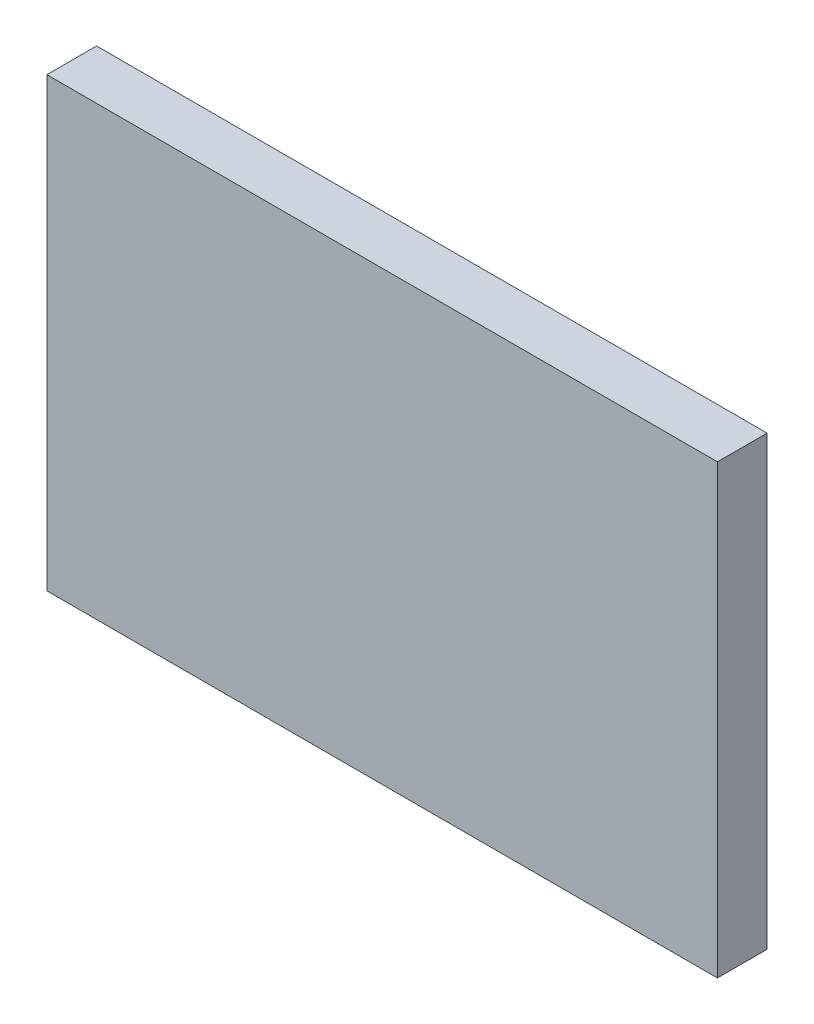
ISO-10303-21;
HEADER;
FILE_DESCRIPTION(('STEP AP214'),'2;1');
FILE_NAME('part.step','',(''),(''),'','','');
FILE_SCHEMA(('AUTOMOTIVE_DESIGN { 1 0 10303 214 1 1 1 1 }'));
ENDSEC;
DATA;
#1=APPLICATION_CONTEXT('core data for automotive mechanical design processes');
#2=APPLICATION_PROTOCOL_DEFINITION('international standard','automotive_design',2000,#1);
#3=PRODUCT_CONTEXT('',#1,'mechanical');
#4=PRODUCT('Part','Part','',(#3));
#5=PRODUCT_RELATED_PRODUCT_CATEGORY('part','',(#4));
#6=PRODUCT_DEFINITION_FORMATION('','',#4);
#7=PRODUCT_DEFINITION_CONTEXT('part definition',#1,'design');
#8=PRODUCT_DEFINITION('design','',#6,#7);
#9=PRODUCT_DEFINITION_SHAPE('','',#8);
#10=(LENGTH_UNIT() NAMED_UNIT(*) SI_UNIT(.MILLI.,.METRE.));
#11=(NAMED_UNIT(*) PLANE_ANGLE_UNIT() SI_UNIT($,.RADIAN.));
#12=(NAMED_UNIT(*) SI_UNIT($,.STERADIAN.) SOLID_ANGLE_UNIT());
#13=UNCERTAINTY_MEASURE_WITH_UNIT(LENGTH_MEASURE(1.E-05),#10,'distance_accuracy_value','');
#14=(GEOMETRIC_REPRESENTATION_CONTEXT(3) GLOBAL_UNCERTAINTY_ASSIGNED_CONTEXT((#13)) GLOBAL_UNIT_ASSIGNED_CONTEXT((#10,
#11,#12)) REPRESENTATION_CONTEXT('',''));
#15=CARTESIAN_POINT('',(0.,0.,0.));
#16=DIRECTION('',(0.,0.,1.));
#17=DIRECTION('',(1.,0.,0.));
#18=AXIS2_PLACEMENT_3D('',#15,#16,#17);
#19=CARTESIAN_POINT('',(0.,0.,12.7));
#20=DIRECTION('',(1.,0.,0.));
#21=DIRECTION('',(0.,0.,-1.));
#22=AXIS2_PLACEMENT_3D('',#19,#20,#21);
#23=PLANE('',#22);
#24=DIRECTION('',(0.,-1.,0.));
#25=VECTOR('',#24,1.);
#26=CARTESIAN_POINT('',(0.,0.,0.));
#27=LINE('',#26,#25);
#28=CARTESIAN_POINT('',(0.,114.3,0.));
#29=VERTEX_POINT('',#28);
#30=CARTESIAN_POINT('',(0.,0.,0.));
#31=VERTEX_POINT('',#30);
#32=EDGE_CURVE('E96',#29,#31,#27,.T.);
#33=ORIENTED_EDGE('',*,*,#32,.T.);
#34=DIRECTION('',(0.,0.,-1.));
#35=VECTOR('',#34,1.);
#36=CARTESIAN_POINT('',(0.,0.,12.7));
#37=LINE('',#36,#35);
#38=CARTESIAN_POINT('',(0.,0.,12.7));
#39=VERTEX_POINT('',#38);
#40=EDGE_CURVE('E11',#39,#31,#37,.T.);
#41=ORIENTED_EDGE('',*,*,#40,.F.);
#42=DIRECTION('',(0.,-1.,0.));
#43=VECTOR('',#42,1.);
#44=CARTESIAN_POINT('',(0.,0.,12.7));
#45=LINE('',#44,#43);
#46=CARTESIAN_POINT('',(0.,114.3,12.7));
#47=VERTEX_POINT('',#46);
#48=EDGE_CURVE('E84',#47,#39,#45,.T.);
#49=ORIENTED_EDGE('',*,*,#48,.F.);
#50=DIRECTION('',(0.,0.,-1.));
#51=VECTOR('',#50,1.);
#52=CARTESIAN_POINT('',(0.,114.3,12.7));
#53=LINE('',#52,#51);
#54=EDGE_CURVE('E92',#47,#29,#53,.T.);
#55=ORIENTED_EDGE('',*,*,#54,.T.);
#56=EDGE_LOOP('',(#33,#41,#49,#55));
#57=FACE_BOUND('',#56,.T.);
#58=ADVANCED_FACE('F33',(#57),#23,.F.);
#59=CARTESIAN_POINT('',(0.,0.,12.7));
#60=DIRECTION('',(0.,1.,0.));
#61=DIRECTION('',(0.,0.,1.));
#62=AXIS2_PLACEMENT_3D('',#59,#60,#61);
#63=PLANE('',#62);
#64=DIRECTION('',(1.,0.,0.));
#65=VECTOR('',#64,1.);
#66=CARTESIAN_POINT('',(0.,0.,0.));
#67=LINE('',#66,#65);
#68=CARTESIAN_POINT('',(171.45,0.,0.));
#69=VERTEX_POINT('',#68);
#70=EDGE_CURVE('E88',#31,#69,#67,.T.);
#71=ORIENTED_EDGE('',*,*,#70,.T.);
#72=DIRECTION('',(0.,0.,-1.));
#73=VECTOR('',#72,1.);
#74=CARTESIAN_POINT('',(171.45,0.,12.7));
#75=LINE('',#74,#73);
#76=CARTESIAN_POINT('',(171.45,0.,12.7));
#77=VERTEX_POINT('',#76);
#78=EDGE_CURVE('E41',#77,#69,#75,.T.);
#79=ORIENTED_EDGE('',*,*,#78,.F.);
#80=DIRECTION('',(1.,0.,0.));
#81=VECTOR('',#80,1.);
#82=CARTESIAN_POINT('',(0.,0.,12.7));
#83=LINE('',#82,#81);
#84=EDGE_CURVE('E79',#39,#77,#83,.T.);
#85=ORIENTED_EDGE('',*,*,#84,.F.);
#86=ORIENTED_EDGE('',*,*,#40,.T.);
#87=EDGE_LOOP('',(#71,#79,#85,#86));
#88=FACE_BOUND('',#87,.T.);
#89=ADVANCED_FACE('F87',(#88),#63,.F.);
#90=CARTESIAN_POINT('',(171.45,0.,12.7));
#91=DIRECTION('',(-1.,0.,0.));
#92=DIRECTION('',(0.,0.,1.));
#93=AXIS2_PLACEMENT_3D('',#90,#91,#92);
#94=PLANE('',#93);
#95=DIRECTION('',(0.,1.,0.));
#96=VECTOR('',#95,1.);
#97=CARTESIAN_POINT('',(171.45,0.,0.));
#98=LINE('',#97,#96);
#99=CARTESIAN_POINT('',(171.45,114.3,0.));
#100=VERTEX_POINT('',#99);
#101=EDGE_CURVE('E66',#69,#100,#98,.T.);
#102=ORIENTED_EDGE('',*,*,#101,.T.);
#103=DIRECTION('',(0.,0.,-1.));
#104=VECTOR('',#103,1.);
#105=CARTESIAN_POINT('',(171.45,114.3,12.7));
#106=LINE('',#105,#104);
#107=CARTESIAN_POINT('',(171.45,114.3,12.7));
#108=VERTEX_POINT('',#107);
#109=EDGE_CURVE('E89',#108,#100,#106,.T.);
#110=ORIENTED_EDGE('',*,*,#109,.F.);
#111=DIRECTION('',(0.,1.,0.));
#112=VECTOR('',#111,1.);
#113=CARTESIAN_POINT('',(171.45,0.,12.7));
#114=LINE('',#113,#112);
#115=EDGE_CURVE('E82',#77,#108,#114,.T.);
#116=ORIENTED_EDGE('',*,*,#115,.F.);
#117=ORIENTED_EDGE('',*,*,#78,.T.);
#118=EDGE_LOOP('',(#102,#110,#116,#117));
#119=FACE_BOUND('',#118,.T.);
#120=ADVANCED_FACE('F90',(#119),#94,.F.);
#121=CARTESIAN_POINT('',(0.,114.3,12.7));
#122=DIRECTION('',(0.,-1.,0.));
#123=DIRECTION('',(1.,0.,0.));
#124=AXIS2_PLACEMENT_3D('',#121,#122,#123);
#125=PLANE('',#124);
#126=DIRECTION('',(-1.,0.,0.));
#127=VECTOR('',#126,1.);
#128=CARTESIAN_POINT('',(0.,114.3,0.));
#129=LINE('',#128,#127);
#130=EDGE_CURVE('E72',#100,#29,#129,.T.);
#131=ORIENTED_EDGE('',*,*,#130,.T.);
#132=ORIENTED_EDGE('',*,*,#54,.F.);
#133=DIRECTION('',(-1.,0.,0.));
#134=VECTOR('',#133,1.);
#135=CARTESIAN_POINT('',(0.,114.3,12.7));
#136=LINE('',#135,#134);
#137=EDGE_CURVE('E49',#108,#47,#136,.T.);
#138=ORIENTED_EDGE('',*,*,#137,.F.);
#139=ORIENTED_EDGE('',*,*,#109,.T.);
#140=EDGE_LOOP('',(#131,#132,#138,#139));
#141=FACE_BOUND('',#140,.T.);
#142=ADVANCED_FACE('F103',(#141),#125,.F.);
#143=CARTESIAN_POINT('',(0.,0.,12.7));
#144=DIRECTION('',(0.,0.,-1.));
#145=DIRECTION('',(-1.,0.,0.));
#146=AXIS2_PLACEMENT_3D('',#143,#144,#145);
#147=PLANE('',#146);
#148=ORIENTED_EDGE('',*,*,#48,.T.);
#149=ORIENTED_EDGE('',*,*,#84,.T.);
#150=ORIENTED_EDGE('',*,*,#115,.T.);
#151=ORIENTED_EDGE('',*,*,#137,.T.);
#152=EDGE_LOOP('',(#148,#149,#150,#151));
#153=FACE_BOUND('',#152,.T.);
#154=ADVANCED_FACE('F80',(#153),#147,.F.);
#155=CARTESIAN_POINT('',(0.,0.,0.));
#156=DIRECTION('',(0.,0.,-1.));
#157=DIRECTION('',(-1.,0.,0.));
#158=AXIS2_PLACEMENT_3D('',#155,#156,#157);
#159=PLANE('',#158);
#160=ORIENTED_EDGE('',*,*,#32,.F.);
#161=ORIENTED_EDGE('',*,*,#130,.F.);
#162=ORIENTED_EDGE('',*,*,#101,.F.);
#163=ORIENTED_EDGE('',*,*,#70,.F.);
#164=EDGE_LOOP('',(#160,#161,#162,#163));
#165=FACE_BOUND('',#164,.T.);
#166=ADVANCED_FACE('F106',(#165),#159,.T.);
#167=CLOSED_SHELL('',(#58,#89,#120,#142,#154,#166));
#168=MANIFOLD_SOLID_BREP('B2',#167);
#169=ADVANCED_BREP_SHAPE_REPRESENTATION('',(#18,#168),#14);
#170=SHAPE_DEFINITION_REPRESENTATION(#9,#169);
ENDSEC;
END-ISO-10303-21;
